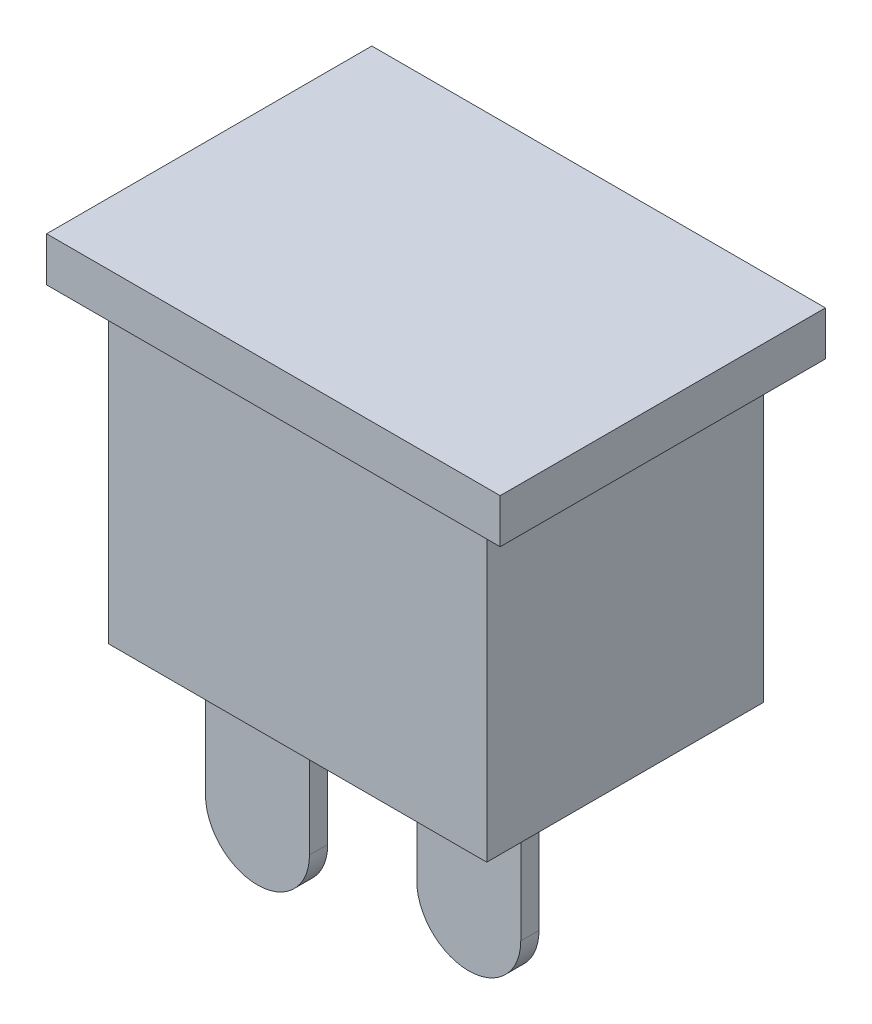
ISO-10303-21;
HEADER;
FILE_DESCRIPTION(('STEP AP214'),'2;1');
FILE_NAME('part.step','',(''),(''),'','','');
FILE_SCHEMA(('AUTOMOTIVE_DESIGN { 1 0 10303 214 1 1 1 1 }'));
ENDSEC;
DATA;
#1=APPLICATION_CONTEXT('core data for automotive mechanical design processes');
#2=APPLICATION_PROTOCOL_DEFINITION('international standard','automotive_design',2000,#1);
#3=PRODUCT_CONTEXT('',#1,'mechanical');
#4=PRODUCT('Part','Part','',(#3));
#5=PRODUCT_RELATED_PRODUCT_CATEGORY('part','',(#4));
#6=PRODUCT_DEFINITION_FORMATION('','',#4);
#7=PRODUCT_DEFINITION_CONTEXT('part definition',#1,'design');
#8=PRODUCT_DEFINITION('design','',#6,#7);
#9=PRODUCT_DEFINITION_SHAPE('','',#8);
#10=(LENGTH_UNIT() NAMED_UNIT(*) SI_UNIT(.MILLI.,.METRE.));
#11=(NAMED_UNIT(*) PLANE_ANGLE_UNIT() SI_UNIT($,.RADIAN.));
#12=(NAMED_UNIT(*) SI_UNIT($,.STERADIAN.) SOLID_ANGLE_UNIT());
#13=UNCERTAINTY_MEASURE_WITH_UNIT(LENGTH_MEASURE(1.E-05),#10,'distance_accuracy_value','');
#14=(GEOMETRIC_REPRESENTATION_CONTEXT(3) GLOBAL_UNCERTAINTY_ASSIGNED_CONTEXT((#13)) GLOBAL_UNIT_ASSIGNED_CONTEXT((#10,
#11,#12)) REPRESENTATION_CONTEXT('',''));
#15=CARTESIAN_POINT('',(0.,0.,0.));
#16=DIRECTION('',(0.,0.,1.));
#17=DIRECTION('',(1.,0.,0.));
#18=AXIS2_PLACEMENT_3D('',#15,#16,#17);
#19=CARTESIAN_POINT('',(13.1953,-19.6596,-4.1783));
#20=DIRECTION('',(0.,0.,-1.));
#21=DIRECTION('',(-1.,0.,0.));
#22=AXIS2_PLACEMENT_3D('',#19,#20,#21);
#23=CYLINDRICAL_SURFACE('',#22,2.3876);
#24=DIRECTION('',(0.,0.,-1.));
#25=VECTOR('',#24,1.);
#26=CARTESIAN_POINT('',(10.8077,-19.6596,-4.1783));
#27=LINE('',#26,#25);
#28=CARTESIAN_POINT('',(10.8077,-19.6596,-4.1783));
#29=VERTEX_POINT('',#28);
#30=CARTESIAN_POINT('',(10.8077,-19.6596,-3.3401));
#31=VERTEX_POINT('',#30);
#32=EDGE_CURVE('E320',#29,#31,#27,.F.);
#33=ORIENTED_EDGE('',*,*,#32,.F.);
#34=CARTESIAN_POINT('',(13.1953,-19.6596,-4.1783));
#35=DIRECTION('',(0.,0.,1.));
#36=DIRECTION('',(1.,0.,0.));
#37=AXIS2_PLACEMENT_3D('',#34,#35,#36);
#38=CIRCLE('',#37,2.3876);
#39=CARTESIAN_POINT('',(15.5829,-19.6596,-4.1783));
#40=VERTEX_POINT('',#39);
#41=EDGE_CURVE('E50',#40,#29,#38,.F.);
#42=ORIENTED_EDGE('',*,*,#41,.F.);
#43=DIRECTION('',(0.,0.,-1.));
#44=VECTOR('',#43,1.);
#45=CARTESIAN_POINT('',(15.5829,-19.6596,-4.1783));
#46=LINE('',#45,#44);
#47=CARTESIAN_POINT('',(15.5829,-19.6596,-3.3401));
#48=VERTEX_POINT('',#47);
#49=EDGE_CURVE('E323',#48,#40,#46,.T.);
#50=ORIENTED_EDGE('',*,*,#49,.F.);
#51=CARTESIAN_POINT('',(13.1953,-19.6596,-3.3401));
#52=DIRECTION('',(0.,0.,-1.));
#53=DIRECTION('',(-1.,0.,0.));
#54=AXIS2_PLACEMENT_3D('',#51,#52,#53);
#55=CIRCLE('',#54,2.3876);
#56=EDGE_CURVE('E11',#31,#48,#55,.F.);
#57=ORIENTED_EDGE('',*,*,#56,.F.);
#58=EDGE_LOOP('',(#33,#42,#50,#57));
#59=FACE_BOUND('',#58,.T.);
#60=ADVANCED_FACE('F41',(#59),#23,.T.);
#61=CARTESIAN_POINT('',(4.9276,-19.6596,-2.7432));
#62=DIRECTION('',(0.,0.,-1.));
#63=DIRECTION('',(-1.,0.,0.));
#64=AXIS2_PLACEMENT_3D('',#61,#62,#63);
#65=CYLINDRICAL_SURFACE('',#64,2.3876);
#66=DIRECTION('',(0.,0.,-1.));
#67=VECTOR('',#66,1.);
#68=CARTESIAN_POINT('',(2.54,-19.6596,-2.7432));
#69=LINE('',#68,#67);
#70=CARTESIAN_POINT('',(2.54,-19.6596,-2.7432));
#71=VERTEX_POINT('',#70);
#72=CARTESIAN_POINT('',(2.54,-19.6596,-1.905));
#73=VERTEX_POINT('',#72);
#74=EDGE_CURVE('E298',#71,#73,#69,.F.);
#75=ORIENTED_EDGE('',*,*,#74,.F.);
#76=CARTESIAN_POINT('',(4.9276,-19.6596,-2.7432));
#77=DIRECTION('',(0.,0.,1.));
#78=DIRECTION('',(1.,0.,0.));
#79=AXIS2_PLACEMENT_3D('',#76,#77,#78);
#80=CIRCLE('',#79,2.3876);
#81=CARTESIAN_POINT('',(7.3152,-19.6596,-2.7432));
#82=VERTEX_POINT('',#81);
#83=EDGE_CURVE('E314',#82,#71,#80,.F.);
#84=ORIENTED_EDGE('',*,*,#83,.F.);
#85=DIRECTION('',(0.,0.,-1.));
#86=VECTOR('',#85,1.);
#87=CARTESIAN_POINT('',(7.3152,-19.6596,-2.7432));
#88=LINE('',#87,#86);
#89=CARTESIAN_POINT('',(7.3152,-19.6596,-1.905));
#90=VERTEX_POINT('',#89);
#91=EDGE_CURVE('E310',#90,#82,#88,.T.);
#92=ORIENTED_EDGE('',*,*,#91,.F.);
#93=CARTESIAN_POINT('',(4.9276,-19.6596,-1.905));
#94=DIRECTION('',(0.,0.,-1.));
#95=DIRECTION('',(-1.,0.,0.));
#96=AXIS2_PLACEMENT_3D('',#93,#94,#95);
#97=CIRCLE('',#96,2.3876);
#98=EDGE_CURVE('E317',#73,#90,#97,.F.);
#99=ORIENTED_EDGE('',*,*,#98,.F.);
#100=EDGE_LOOP('',(#75,#84,#92,#99));
#101=FACE_BOUND('',#100,.T.);
#102=ADVANCED_FACE('F337',(#101),#65,.T.);
#103=CARTESIAN_POINT('',(0.,-13.97,0.));
#104=DIRECTION('',(0.,-1.,0.));
#105=DIRECTION('',(0.,0.,-1.));
#106=AXIS2_PLACEMENT_3D('',#103,#104,#105);
#107=PLANE('',#106);
#108=DIRECTION('',(0.,0.,1.));
#109=VECTOR('',#108,1.);
#110=CARTESIAN_POINT('',(0.,-13.97,0.));
#111=LINE('',#110,#109);
#112=CARTESIAN_POINT('',(0.,-13.97,-12.7));
#113=VERTEX_POINT('',#112);
#114=CARTESIAN_POINT('',(0.,-13.97,0.));
#115=VERTEX_POINT('',#114);
#116=EDGE_CURVE('E262',#113,#115,#111,.T.);
#117=ORIENTED_EDGE('',*,*,#116,.F.);
#118=DIRECTION('',(-1.,0.,0.));
#119=VECTOR('',#118,1.);
#120=CARTESIAN_POINT('',(0.,-13.97,-12.7));
#121=LINE('',#120,#119);
#122=CARTESIAN_POINT('',(17.3609,-13.97,-12.7));
#123=VERTEX_POINT('',#122);
#124=EDGE_CURVE('E275',#123,#113,#121,.T.);
#125=ORIENTED_EDGE('',*,*,#124,.F.);
#126=DIRECTION('',(0.,0.,-1.));
#127=VECTOR('',#126,1.);
#128=CARTESIAN_POINT('',(17.3609,-13.97,0.));
#129=LINE('',#128,#127);
#130=CARTESIAN_POINT('',(17.3609,-13.97,0.));
#131=VERTEX_POINT('',#130);
#132=EDGE_CURVE('E271',#131,#123,#129,.T.);
#133=ORIENTED_EDGE('',*,*,#132,.F.);
#134=DIRECTION('',(1.,0.,0.));
#135=VECTOR('',#134,1.);
#136=CARTESIAN_POINT('',(0.,-13.97,0.));
#137=LINE('',#136,#135);
#138=EDGE_CURVE('E266',#115,#131,#137,.T.);
#139=ORIENTED_EDGE('',*,*,#138,.F.);
#140=EDGE_LOOP('',(#117,#125,#133,#139));
#141=FACE_BOUND('',#140,.T.);
#142=DIRECTION('',(1.,0.,0.));
#143=VECTOR('',#142,1.);
#144=CARTESIAN_POINT('',(2.54,-13.97,-2.7432));
#145=LINE('',#144,#143);
#146=CARTESIAN_POINT('',(2.54,-13.97,-2.7432));
#147=VERTEX_POINT('',#146);
#148=CARTESIAN_POINT('',(7.3152,-13.97,-2.7432));
#149=VERTEX_POINT('',#148);
#150=EDGE_CURVE('E195',#147,#149,#145,.T.);
#151=ORIENTED_EDGE('',*,*,#150,.F.);
#152=DIRECTION('',(0.,0.,-1.));
#153=VECTOR('',#152,1.);
#154=CARTESIAN_POINT('',(2.54,-13.97,-2.7432));
#155=LINE('',#154,#153);
#156=CARTESIAN_POINT('',(2.54,-13.97,-1.905));
#157=VERTEX_POINT('',#156);
#158=EDGE_CURVE('E162',#157,#147,#155,.T.);
#159=ORIENTED_EDGE('',*,*,#158,.F.);
#160=DIRECTION('',(-1.,0.,0.));
#161=VECTOR('',#160,1.);
#162=CARTESIAN_POINT('',(2.54,-13.97,-1.905));
#163=LINE('',#162,#161);
#164=CARTESIAN_POINT('',(7.3152,-13.97,-1.905));
#165=VERTEX_POINT('',#164);
#166=EDGE_CURVE('E203',#165,#157,#163,.T.);
#167=ORIENTED_EDGE('',*,*,#166,.F.);
#168=DIRECTION('',(0.,0.,1.));
#169=VECTOR('',#168,1.);
#170=CARTESIAN_POINT('',(7.3152,-13.97,-2.7432));
#171=LINE('',#170,#169);
#172=EDGE_CURVE('E199',#149,#165,#171,.T.);
#173=ORIENTED_EDGE('',*,*,#172,.F.);
#174=EDGE_LOOP('',(#151,#159,#167,#173));
#175=FACE_BOUND('',#174,.T.);
#176=DIRECTION('',(1.,0.,0.));
#177=VECTOR('',#176,1.);
#178=CARTESIAN_POINT('',(10.8077,-13.97,-4.1783));
#179=LINE('',#178,#177);
#180=CARTESIAN_POINT('',(10.8077,-13.97,-4.1783));
#181=VERTEX_POINT('',#180);
#182=CARTESIAN_POINT('',(15.5829,-13.97,-4.1783));
#183=VERTEX_POINT('',#182);
#184=EDGE_CURVE('E157',#181,#183,#179,.T.);
#185=ORIENTED_EDGE('',*,*,#184,.F.);
#186=DIRECTION('',(0.,0.,-1.));
#187=VECTOR('',#186,1.);
#188=CARTESIAN_POINT('',(10.8077,-13.97,-4.1783));
#189=LINE('',#188,#187);
#190=CARTESIAN_POINT('',(10.8077,-13.97,-3.3401));
#191=VERTEX_POINT('',#190);
#192=EDGE_CURVE('E166',#191,#181,#189,.T.);
#193=ORIENTED_EDGE('',*,*,#192,.F.);
#194=DIRECTION('',(-1.,0.,0.));
#195=VECTOR('',#194,1.);
#196=CARTESIAN_POINT('',(10.8077,-13.97,-3.3401));
#197=LINE('',#196,#195);
#198=CARTESIAN_POINT('',(15.5829,-13.97,-3.3401));
#199=VERTEX_POINT('',#198);
#200=EDGE_CURVE('E180',#199,#191,#197,.T.);
#201=ORIENTED_EDGE('',*,*,#200,.F.);
#202=DIRECTION('',(0.,0.,1.));
#203=VECTOR('',#202,1.);
#204=CARTESIAN_POINT('',(15.5829,-13.97,-4.1783));
#205=LINE('',#204,#203);
#206=EDGE_CURVE('E176',#183,#199,#205,.T.);
#207=ORIENTED_EDGE('',*,*,#206,.F.);
#208=EDGE_LOOP('',(#185,#193,#201,#207));
#209=FACE_BOUND('',#208,.T.);
#210=ADVANCED_FACE('F174',(#141,#175,#209),#107,.T.);
#211=CARTESIAN_POINT('',(0.,-13.97,0.));
#212=DIRECTION('',(-1.,0.,0.));
#213=DIRECTION('',(0.,0.,1.));
#214=AXIS2_PLACEMENT_3D('',#211,#212,#213);
#215=PLANE('',#214);
#216=DIRECTION('',(0.,0.,1.));
#217=VECTOR('',#216,1.);
#218=CARTESIAN_POINT('',(0.,0.,0.));
#219=LINE('',#218,#217);
#220=CARTESIAN_POINT('',(0.,0.,-12.7));
#221=VERTEX_POINT('',#220);
#222=CARTESIAN_POINT('',(0.,0.,0.));
#223=VERTEX_POINT('',#222);
#224=EDGE_CURVE('E261',#221,#223,#219,.T.);
#225=ORIENTED_EDGE('',*,*,#224,.F.);
#226=DIRECTION('',(0.,1.,0.));
#227=VECTOR('',#226,1.);
#228=CARTESIAN_POINT('',(0.,-13.97,-12.7));
#229=LINE('',#228,#227);
#230=EDGE_CURVE('E294',#113,#221,#229,.T.);
#231=ORIENTED_EDGE('',*,*,#230,.F.);
#232=ORIENTED_EDGE('',*,*,#116,.T.);
#233=DIRECTION('',(0.,1.,0.));
#234=VECTOR('',#233,1.);
#235=CARTESIAN_POINT('',(0.,-13.97,0.));
#236=LINE('',#235,#234);
#237=EDGE_CURVE('E279',#115,#223,#236,.T.);
#238=ORIENTED_EDGE('',*,*,#237,.T.);
#239=EDGE_LOOP('',(#225,#231,#232,#238));
#240=FACE_BOUND('',#239,.T.);
#241=ADVANCED_FACE('F345',(#240),#215,.T.);
#242=CARTESIAN_POINT('',(0.,-13.97,-12.7));
#243=DIRECTION('',(0.,0.,-1.));
#244=DIRECTION('',(-1.,0.,0.));
#245=AXIS2_PLACEMENT_3D('',#242,#243,#244);
#246=PLANE('',#245);
#247=DIRECTION('',(-1.,0.,0.));
#248=VECTOR('',#247,1.);
#249=CARTESIAN_POINT('',(0.,0.,-12.7));
#250=LINE('',#249,#248);
#251=CARTESIAN_POINT('',(17.3609,0.,-12.7));
#252=VERTEX_POINT('',#251);
#253=EDGE_CURVE('E267',#252,#221,#250,.T.);
#254=ORIENTED_EDGE('',*,*,#253,.F.);
#255=DIRECTION('',(0.,1.,0.));
#256=VECTOR('',#255,1.);
#257=CARTESIAN_POINT('',(17.3609,-13.97,-12.7));
#258=LINE('',#257,#256);
#259=EDGE_CURVE('E299',#123,#252,#258,.T.);
#260=ORIENTED_EDGE('',*,*,#259,.F.);
#261=ORIENTED_EDGE('',*,*,#124,.T.);
#262=ORIENTED_EDGE('',*,*,#230,.T.);
#263=EDGE_LOOP('',(#254,#260,#261,#262));
#264=FACE_BOUND('',#263,.T.);
#265=ADVANCED_FACE('F355',(#264),#246,.T.);
#266=CARTESIAN_POINT('',(17.3609,-13.97,0.));
#267=DIRECTION('',(1.,0.,0.));
#268=DIRECTION('',(0.,0.,-1.));
#269=AXIS2_PLACEMENT_3D('',#266,#267,#268);
#270=PLANE('',#269);
#271=DIRECTION('',(0.,0.,-1.));
#272=VECTOR('',#271,1.);
#273=CARTESIAN_POINT('',(17.3609,0.,0.));
#274=LINE('',#273,#272);
#275=CARTESIAN_POINT('',(17.3609,0.,0.));
#276=VERTEX_POINT('',#275);
#277=EDGE_CURVE('E287',#276,#252,#274,.T.);
#278=ORIENTED_EDGE('',*,*,#277,.F.);
#279=DIRECTION('',(0.,1.,0.));
#280=VECTOR('',#279,1.);
#281=CARTESIAN_POINT('',(17.3609,-13.97,0.));
#282=LINE('',#281,#280);
#283=EDGE_CURVE('E302',#131,#276,#282,.T.);
#284=ORIENTED_EDGE('',*,*,#283,.F.);
#285=ORIENTED_EDGE('',*,*,#132,.T.);
#286=ORIENTED_EDGE('',*,*,#259,.T.);
#287=EDGE_LOOP('',(#278,#284,#285,#286));
#288=FACE_BOUND('',#287,.T.);
#289=ADVANCED_FACE('F361',(#288),#270,.T.);
#290=CARTESIAN_POINT('',(0.,-13.97,0.));
#291=DIRECTION('',(0.,0.,1.));
#292=DIRECTION('',(1.,0.,0.));
#293=AXIS2_PLACEMENT_3D('',#290,#291,#292);
#294=PLANE('',#293);
#295=DIRECTION('',(1.,0.,0.));
#296=VECTOR('',#295,1.);
#297=CARTESIAN_POINT('',(0.,0.,0.));
#298=LINE('',#297,#296);
#299=EDGE_CURVE('E283',#223,#276,#298,.T.);
#300=ORIENTED_EDGE('',*,*,#299,.F.);
#301=ORIENTED_EDGE('',*,*,#237,.F.);
#302=ORIENTED_EDGE('',*,*,#138,.T.);
#303=ORIENTED_EDGE('',*,*,#283,.T.);
#304=EDGE_LOOP('',(#300,#301,#302,#303));
#305=FACE_BOUND('',#304,.T.);
#306=ADVANCED_FACE('F357',(#305),#294,.T.);
#307=CARTESIAN_POINT('',(-1.73355,2.032,1.1176));
#308=DIRECTION('',(1.,0.,0.));
#309=DIRECTION('',(0.,0.,-1.));
#310=AXIS2_PLACEMENT_3D('',#307,#308,#309);
#311=PLANE('',#310);
#312=DIRECTION('',(0.,0.,1.));
#313=VECTOR('',#312,1.);
#314=CARTESIAN_POINT('',(-1.73355,0.,1.1176));
#315=LINE('',#314,#313);
#316=CARTESIAN_POINT('',(-1.73355,0.,-13.8176));
#317=VERTEX_POINT('',#316);
#318=CARTESIAN_POINT('',(-1.73355,0.,1.1176));
#319=VERTEX_POINT('',#318);
#320=EDGE_CURVE('E219',#317,#319,#315,.T.);
#321=ORIENTED_EDGE('',*,*,#320,.T.);
#322=DIRECTION('',(0.,-1.,0.));
#323=VECTOR('',#322,1.);
#324=CARTESIAN_POINT('',(-1.73355,2.032,1.1176));
#325=LINE('',#324,#323);
#326=CARTESIAN_POINT('',(-1.73355,2.032,1.1176));
#327=VERTEX_POINT('',#326);
#328=EDGE_CURVE('E257',#327,#319,#325,.T.);
#329=ORIENTED_EDGE('',*,*,#328,.F.);
#330=DIRECTION('',(0.,0.,1.));
#331=VECTOR('',#330,1.);
#332=CARTESIAN_POINT('',(-1.73355,2.032,1.1176));
#333=LINE('',#332,#331);
#334=CARTESIAN_POINT('',(-1.73355,2.032,-13.8176));
#335=VERTEX_POINT('',#334);
#336=EDGE_CURVE('E220',#335,#327,#333,.T.);
#337=ORIENTED_EDGE('',*,*,#336,.F.);
#338=DIRECTION('',(0.,-1.,0.));
#339=VECTOR('',#338,1.);
#340=CARTESIAN_POINT('',(-1.73355,2.032,-13.8176));
#341=LINE('',#340,#339);
#342=EDGE_CURVE('E234',#335,#317,#341,.T.);
#343=ORIENTED_EDGE('',*,*,#342,.T.);
#344=EDGE_LOOP('',(#321,#329,#337,#343));
#345=FACE_BOUND('',#344,.T.);
#346=ADVANCED_FACE('F360',(#345),#311,.F.);
#347=CARTESIAN_POINT('',(-1.73355,2.032,1.1176));
#348=DIRECTION('',(0.,0.,-1.));
#349=DIRECTION('',(-1.,0.,0.));
#350=AXIS2_PLACEMENT_3D('',#347,#348,#349);
#351=PLANE('',#350);
#352=DIRECTION('',(1.,0.,0.));
#353=VECTOR('',#352,1.);
#354=CARTESIAN_POINT('',(-1.73355,0.,1.1176));
#355=LINE('',#354,#353);
#356=CARTESIAN_POINT('',(19.09445,0.,1.1176));
#357=VERTEX_POINT('',#356);
#358=EDGE_CURVE('E238',#319,#357,#355,.T.);
#359=ORIENTED_EDGE('',*,*,#358,.T.);
#360=DIRECTION('',(0.,-1.,0.));
#361=VECTOR('',#360,1.);
#362=CARTESIAN_POINT('',(19.09445,2.032,1.1176));
#363=LINE('',#362,#361);
#364=CARTESIAN_POINT('',(19.09445,2.032,1.1176));
#365=VERTEX_POINT('',#364);
#366=EDGE_CURVE('E253',#365,#357,#363,.T.);
#367=ORIENTED_EDGE('',*,*,#366,.F.);
#368=DIRECTION('',(1.,0.,0.));
#369=VECTOR('',#368,1.);
#370=CARTESIAN_POINT('',(-1.73355,2.032,1.1176));
#371=LINE('',#370,#369);
#372=EDGE_CURVE('E224',#327,#365,#371,.T.);
#373=ORIENTED_EDGE('',*,*,#372,.F.);
#374=ORIENTED_EDGE('',*,*,#328,.T.);
#375=EDGE_LOOP('',(#359,#367,#373,#374));
#376=FACE_BOUND('',#375,.T.);
#377=ADVANCED_FACE('F371',(#376),#351,.F.);
#378=CARTESIAN_POINT('',(19.09445,2.032,1.1176));
#379=DIRECTION('',(-1.,0.,0.));
#380=DIRECTION('',(0.,0.,1.));
#381=AXIS2_PLACEMENT_3D('',#378,#379,#380);
#382=PLANE('',#381);
#383=DIRECTION('',(0.,0.,-1.));
#384=VECTOR('',#383,1.);
#385=CARTESIAN_POINT('',(19.09445,0.,1.1176));
#386=LINE('',#385,#384);
#387=CARTESIAN_POINT('',(19.09445,0.,-13.8176));
#388=VERTEX_POINT('',#387);
#389=EDGE_CURVE('E241',#357,#388,#386,.T.);
#390=ORIENTED_EDGE('',*,*,#389,.T.);
#391=DIRECTION('',(0.,-1.,0.));
#392=VECTOR('',#391,1.);
#393=CARTESIAN_POINT('',(19.09445,2.032,-13.8176));
#394=LINE('',#393,#392);
#395=CARTESIAN_POINT('',(19.09445,2.032,-13.8176));
#396=VERTEX_POINT('',#395);
#397=EDGE_CURVE('E249',#396,#388,#394,.T.);
#398=ORIENTED_EDGE('',*,*,#397,.F.);
#399=DIRECTION('',(0.,0.,-1.));
#400=VECTOR('',#399,1.);
#401=CARTESIAN_POINT('',(19.09445,2.032,1.1176));
#402=LINE('',#401,#400);
#403=EDGE_CURVE('E228',#365,#396,#402,.T.);
#404=ORIENTED_EDGE('',*,*,#403,.F.);
#405=ORIENTED_EDGE('',*,*,#366,.T.);
#406=EDGE_LOOP('',(#390,#398,#404,#405));
#407=FACE_BOUND('',#406,.T.);
#408=ADVANCED_FACE('F375',(#407),#382,.F.);
#409=CARTESIAN_POINT('',(-1.73355,2.032,-13.8176));
#410=DIRECTION('',(0.,0.,1.));
#411=DIRECTION('',(1.,0.,0.));
#412=AXIS2_PLACEMENT_3D('',#409,#410,#411);
#413=PLANE('',#412);
#414=DIRECTION('',(-1.,0.,0.));
#415=VECTOR('',#414,1.);
#416=CARTESIAN_POINT('',(-1.73355,0.,-13.8176));
#417=LINE('',#416,#415);
#418=EDGE_CURVE('E225',#388,#317,#417,.T.);
#419=ORIENTED_EDGE('',*,*,#418,.T.);
#420=ORIENTED_EDGE('',*,*,#342,.F.);
#421=DIRECTION('',(-1.,0.,0.));
#422=VECTOR('',#421,1.);
#423=CARTESIAN_POINT('',(-1.73355,2.032,-13.8176));
#424=LINE('',#423,#422);
#425=EDGE_CURVE('E231',#396,#335,#424,.T.);
#426=ORIENTED_EDGE('',*,*,#425,.F.);
#427=ORIENTED_EDGE('',*,*,#397,.T.);
#428=EDGE_LOOP('',(#419,#420,#426,#427));
#429=FACE_BOUND('',#428,.T.);
#430=ADVANCED_FACE('F379',(#429),#413,.F.);
#431=CARTESIAN_POINT('',(0.,2.032,0.));
#432=DIRECTION('',(0.,-1.,0.));
#433=DIRECTION('',(0.,0.,-1.));
#434=AXIS2_PLACEMENT_3D('',#431,#432,#433);
#435=PLANE('',#434);
#436=ORIENTED_EDGE('',*,*,#336,.T.);
#437=ORIENTED_EDGE('',*,*,#372,.T.);
#438=ORIENTED_EDGE('',*,*,#403,.T.);
#439=ORIENTED_EDGE('',*,*,#425,.T.);
#440=EDGE_LOOP('',(#436,#437,#438,#439));
#441=FACE_BOUND('',#440,.T.);
#442=ADVANCED_FACE('F383',(#441),#435,.F.);
#443=CARTESIAN_POINT('',(0.,0.,0.));
#444=DIRECTION('',(0.,-1.,0.));
#445=DIRECTION('',(0.,0.,-1.));
#446=AXIS2_PLACEMENT_3D('',#443,#444,#445);
#447=PLANE('',#446);
#448=ORIENTED_EDGE('',*,*,#253,.T.);
#449=ORIENTED_EDGE('',*,*,#224,.T.);
#450=ORIENTED_EDGE('',*,*,#299,.T.);
#451=ORIENTED_EDGE('',*,*,#277,.T.);
#452=EDGE_LOOP('',(#448,#449,#450,#451));
#453=FACE_BOUND('',#452,.T.);
#454=ORIENTED_EDGE('',*,*,#320,.F.);
#455=ORIENTED_EDGE('',*,*,#418,.F.);
#456=ORIENTED_EDGE('',*,*,#389,.F.);
#457=ORIENTED_EDGE('',*,*,#358,.F.);
#458=EDGE_LOOP('',(#454,#455,#456,#457));
#459=FACE_BOUND('',#458,.T.);
#460=ADVANCED_FACE('F385',(#453,#459),#447,.T.);
#461=CARTESIAN_POINT('',(2.54,-22.0472,-2.7432));
#462=DIRECTION('',(1.,0.,0.));
#463=DIRECTION('',(0.,0.,-1.));
#464=AXIS2_PLACEMENT_3D('',#461,#462,#463);
#465=PLANE('',#464);
#466=DIRECTION('',(0.,1.,0.));
#467=VECTOR('',#466,1.);
#468=CARTESIAN_POINT('',(2.54,-22.0472,-2.7432));
#469=LINE('',#468,#467);
#470=EDGE_CURVE('E216',#71,#147,#469,.T.);
#471=ORIENTED_EDGE('',*,*,#470,.F.);
#472=ORIENTED_EDGE('',*,*,#74,.T.);
#473=DIRECTION('',(0.,1.,0.));
#474=VECTOR('',#473,1.);
#475=CARTESIAN_POINT('',(2.54,-22.0472,-1.905));
#476=LINE('',#475,#474);
#477=EDGE_CURVE('E207',#73,#157,#476,.T.);
#478=ORIENTED_EDGE('',*,*,#477,.T.);
#479=ORIENTED_EDGE('',*,*,#158,.T.);
#480=EDGE_LOOP('',(#471,#472,#478,#479));
#481=FACE_BOUND('',#480,.T.);
#482=ADVANCED_FACE('F388',(#481),#465,.F.);
#483=CARTESIAN_POINT('',(2.54,-22.0472,-2.7432));
#484=DIRECTION('',(0.,0.,1.));
#485=DIRECTION('',(1.,0.,0.));
#486=AXIS2_PLACEMENT_3D('',#483,#484,#485);
#487=PLANE('',#486);
#488=DIRECTION('',(0.,1.,0.));
#489=VECTOR('',#488,1.);
#490=CARTESIAN_POINT('',(7.3152,-22.0472,-2.7432));
#491=LINE('',#490,#489);
#492=EDGE_CURVE('E213',#82,#149,#491,.T.);
#493=ORIENTED_EDGE('',*,*,#492,.F.);
#494=ORIENTED_EDGE('',*,*,#83,.T.);
#495=ORIENTED_EDGE('',*,*,#470,.T.);
#496=ORIENTED_EDGE('',*,*,#150,.T.);
#497=EDGE_LOOP('',(#493,#494,#495,#496));
#498=FACE_BOUND('',#497,.T.);
#499=ADVANCED_FACE('F395',(#498),#487,.F.);
#500=CARTESIAN_POINT('',(7.3152,-22.0472,-2.7432));
#501=DIRECTION('',(-1.,0.,0.));
#502=DIRECTION('',(0.,0.,1.));
#503=AXIS2_PLACEMENT_3D('',#500,#501,#502);
#504=PLANE('',#503);
#505=DIRECTION('',(0.,1.,0.));
#506=VECTOR('',#505,1.);
#507=CARTESIAN_POINT('',(7.3152,-22.0472,-1.905));
#508=LINE('',#507,#506);
#509=EDGE_CURVE('E210',#90,#165,#508,.T.);
#510=ORIENTED_EDGE('',*,*,#509,.F.);
#511=ORIENTED_EDGE('',*,*,#91,.T.);
#512=ORIENTED_EDGE('',*,*,#492,.T.);
#513=ORIENTED_EDGE('',*,*,#172,.T.);
#514=EDGE_LOOP('',(#510,#511,#512,#513));
#515=FACE_BOUND('',#514,.T.);
#516=ADVANCED_FACE('F399',(#515),#504,.F.);
#517=CARTESIAN_POINT('',(2.54,-22.0472,-1.905));
#518=DIRECTION('',(0.,0.,-1.));
#519=DIRECTION('',(-1.,0.,0.));
#520=AXIS2_PLACEMENT_3D('',#517,#518,#519);
#521=PLANE('',#520);
#522=ORIENTED_EDGE('',*,*,#477,.F.);
#523=ORIENTED_EDGE('',*,*,#98,.T.);
#524=ORIENTED_EDGE('',*,*,#509,.T.);
#525=ORIENTED_EDGE('',*,*,#166,.T.);
#526=EDGE_LOOP('',(#522,#523,#524,#525));
#527=FACE_BOUND('',#526,.T.);
#528=ADVANCED_FACE('F403',(#527),#521,.F.);
#529=CARTESIAN_POINT('',(10.8077,-22.0472,-4.1783));
#530=DIRECTION('',(1.,0.,0.));
#531=DIRECTION('',(0.,0.,-1.));
#532=AXIS2_PLACEMENT_3D('',#529,#530,#531);
#533=PLANE('',#532);
#534=DIRECTION('',(0.,1.,0.));
#535=VECTOR('',#534,1.);
#536=CARTESIAN_POINT('',(10.8077,-22.0472,-4.1783));
#537=LINE('',#536,#535);
#538=EDGE_CURVE('E152',#29,#181,#537,.T.);
#539=ORIENTED_EDGE('',*,*,#538,.F.);
#540=ORIENTED_EDGE('',*,*,#32,.T.);
#541=DIRECTION('',(0.,1.,0.));
#542=VECTOR('',#541,1.);
#543=CARTESIAN_POINT('',(10.8077,-22.0472,-3.3401));
#544=LINE('',#543,#542);
#545=EDGE_CURVE('E168',#31,#191,#544,.T.);
#546=ORIENTED_EDGE('',*,*,#545,.T.);
#547=ORIENTED_EDGE('',*,*,#192,.T.);
#548=EDGE_LOOP('',(#539,#540,#546,#547));
#549=FACE_BOUND('',#548,.T.);
#550=ADVANCED_FACE('F167',(#549),#533,.F.);
#551=CARTESIAN_POINT('',(10.8077,-22.0472,-4.1783));
#552=DIRECTION('',(0.,0.,1.));
#553=DIRECTION('',(1.,0.,0.));
#554=AXIS2_PLACEMENT_3D('',#551,#552,#553);
#555=PLANE('',#554);
#556=DIRECTION('',(0.,1.,0.));
#557=VECTOR('',#556,1.);
#558=CARTESIAN_POINT('',(15.5829,-22.0472,-4.1783));
#559=LINE('',#558,#557);
#560=EDGE_CURVE('E163',#40,#183,#559,.T.);
#561=ORIENTED_EDGE('',*,*,#560,.F.);
#562=ORIENTED_EDGE('',*,*,#41,.T.);
#563=ORIENTED_EDGE('',*,*,#538,.T.);
#564=ORIENTED_EDGE('',*,*,#184,.T.);
#565=EDGE_LOOP('',(#561,#562,#563,#564));
#566=FACE_BOUND('',#565,.T.);
#567=ADVANCED_FACE('F155',(#566),#555,.F.);
#568=CARTESIAN_POINT('',(15.5829,-22.0472,-4.1783));
#569=DIRECTION('',(-1.,0.,0.));
#570=DIRECTION('',(0.,0.,1.));
#571=AXIS2_PLACEMENT_3D('',#568,#569,#570);
#572=PLANE('',#571);
#573=DIRECTION('',(0.,1.,0.));
#574=VECTOR('',#573,1.);
#575=CARTESIAN_POINT('',(15.5829,-22.0472,-3.3401));
#576=LINE('',#575,#574);
#577=EDGE_CURVE('E187',#48,#199,#576,.T.);
#578=ORIENTED_EDGE('',*,*,#577,.F.);
#579=ORIENTED_EDGE('',*,*,#49,.T.);
#580=ORIENTED_EDGE('',*,*,#560,.T.);
#581=ORIENTED_EDGE('',*,*,#206,.T.);
#582=EDGE_LOOP('',(#578,#579,#580,#581));
#583=FACE_BOUND('',#582,.T.);
#584=ADVANCED_FACE('F328',(#583),#572,.F.);
#585=CARTESIAN_POINT('',(10.8077,-22.0472,-3.3401));
#586=DIRECTION('',(0.,0.,-1.));
#587=DIRECTION('',(-1.,0.,0.));
#588=AXIS2_PLACEMENT_3D('',#585,#586,#587);
#589=PLANE('',#588);
#590=ORIENTED_EDGE('',*,*,#545,.F.);
#591=ORIENTED_EDGE('',*,*,#56,.T.);
#592=ORIENTED_EDGE('',*,*,#577,.T.);
#593=ORIENTED_EDGE('',*,*,#200,.T.);
#594=EDGE_LOOP('',(#590,#591,#592,#593));
#595=FACE_BOUND('',#594,.T.);
#596=ADVANCED_FACE('F329',(#595),#589,.F.);
#597=CLOSED_SHELL('',(#60,#102,#210,#241,#265,#289,#306,#346,#377,#408,#430,#442,#460,#482,#499,
#516,#528,#550,#567,#584,#596));
#598=MANIFOLD_SOLID_BREP('B2',#597);
#599=ADVANCED_BREP_SHAPE_REPRESENTATION('',(#18,#598),#14);
#600=SHAPE_DEFINITION_REPRESENTATION(#9,#599);
ENDSEC;
END-ISO-10303-21;
